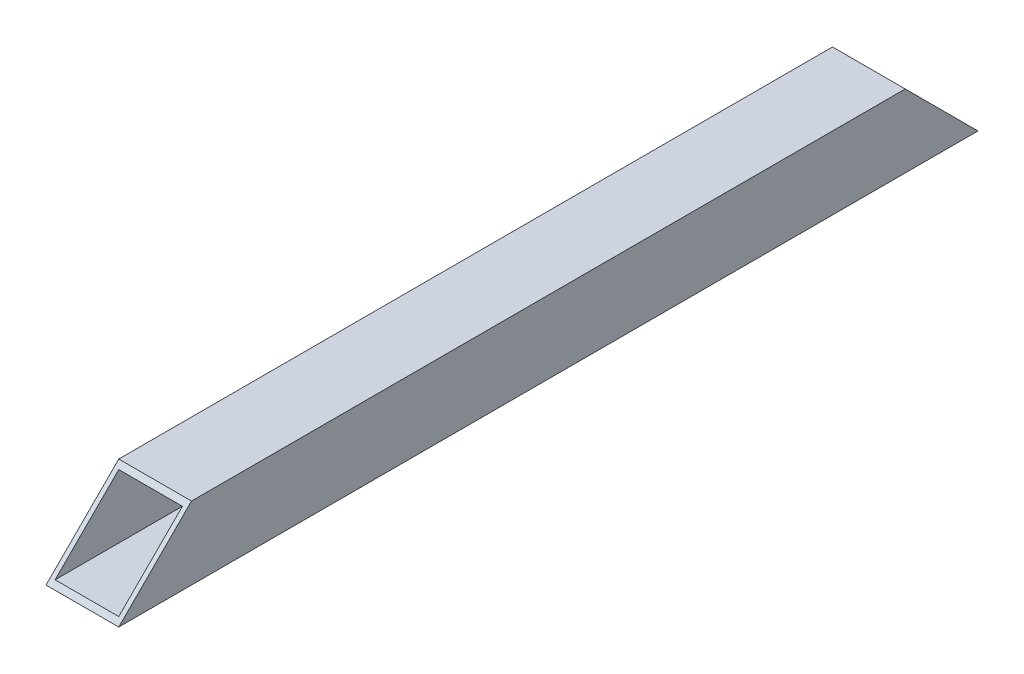
ISO-10303-21;
HEADER;
FILE_DESCRIPTION(('STEP AP214'),'2;1');
FILE_NAME('part.step','',(''),(''),'','','');
FILE_SCHEMA(('AUTOMOTIVE_DESIGN { 1 0 10303 214 1 1 1 1 }'));
ENDSEC;
DATA;
#1=APPLICATION_CONTEXT('core data for automotive mechanical design processes');
#2=APPLICATION_PROTOCOL_DEFINITION('international standard','automotive_design',2000,#1);
#3=PRODUCT_CONTEXT('',#1,'mechanical');
#4=PRODUCT('Part','Part','',(#3));
#5=PRODUCT_RELATED_PRODUCT_CATEGORY('part','',(#4));
#6=PRODUCT_DEFINITION_FORMATION('','',#4);
#7=PRODUCT_DEFINITION_CONTEXT('part definition',#1,'design');
#8=PRODUCT_DEFINITION('design','',#6,#7);
#9=PRODUCT_DEFINITION_SHAPE('','',#8);
#10=(LENGTH_UNIT() NAMED_UNIT(*) SI_UNIT(.MILLI.,.METRE.));
#11=(NAMED_UNIT(*) PLANE_ANGLE_UNIT() SI_UNIT($,.RADIAN.));
#12=(NAMED_UNIT(*) SI_UNIT($,.STERADIAN.) SOLID_ANGLE_UNIT());
#13=UNCERTAINTY_MEASURE_WITH_UNIT(LENGTH_MEASURE(1.E-05),#10,'distance_accuracy_value','');
#14=(GEOMETRIC_REPRESENTATION_CONTEXT(3) GLOBAL_UNCERTAINTY_ASSIGNED_CONTEXT((#13)) GLOBAL_UNIT_ASSIGNED_CONTEXT((#10,
#11,#12)) REPRESENTATION_CONTEXT('',''));
#15=CARTESIAN_POINT('',(0.,0.,0.));
#16=DIRECTION('',(0.,0.,1.));
#17=DIRECTION('',(1.,0.,0.));
#18=AXIS2_PLACEMENT_3D('',#15,#16,#17);
#19=CARTESIAN_POINT('',(11.1125,11.1125,150.));
#20=DIRECTION('',(0.,-1.,0.));
#21=DIRECTION('',(0.,0.,-1.));
#22=AXIS2_PLACEMENT_3D('',#19,#20,#21);
#23=PLANE('',#22);
#24=DIRECTION('',(1.,0.,0.));
#25=VECTOR('',#24,1.);
#26=CARTESIAN_POINT('',(11.1125,11.1125,126.1875));
#27=LINE('',#26,#25);
#28=CARTESIAN_POINT('',(-11.1125,11.1125,126.1875));
#29=VERTEX_POINT('',#28);
#30=CARTESIAN_POINT('',(11.1125,11.1125,126.1875));
#31=VERTEX_POINT('',#30);
#32=EDGE_CURVE('E11',#29,#31,#27,.T.);
#33=ORIENTED_EDGE('',*,*,#32,.F.);
#34=DIRECTION('',(0.,0.,-1.));
#35=VECTOR('',#34,1.);
#36=CARTESIAN_POINT('',(-11.1125,11.1125,150.));
#37=LINE('',#36,#35);
#38=CARTESIAN_POINT('',(-11.1125,11.1125,-126.1875));
#39=VERTEX_POINT('',#38);
#40=EDGE_CURVE('E144',#29,#39,#37,.T.);
#41=ORIENTED_EDGE('',*,*,#40,.T.);
#42=DIRECTION('',(-1.,0.,0.));
#43=VECTOR('',#42,1.);
#44=CARTESIAN_POINT('',(11.1125,11.1125,-126.1875));
#45=LINE('',#44,#43);
#46=CARTESIAN_POINT('',(11.1125,11.1125,-126.1875));
#47=VERTEX_POINT('',#46);
#48=EDGE_CURVE('E44',#47,#39,#45,.T.);
#49=ORIENTED_EDGE('',*,*,#48,.F.);
#50=DIRECTION('',(0.,0.,-1.));
#51=VECTOR('',#50,1.);
#52=CARTESIAN_POINT('',(11.1125,11.1125,150.));
#53=LINE('',#52,#51);
#54=EDGE_CURVE('E151',#31,#47,#53,.T.);
#55=ORIENTED_EDGE('',*,*,#54,.F.);
#56=EDGE_LOOP('',(#33,#41,#49,#55));
#57=FACE_BOUND('',#56,.T.);
#58=ADVANCED_FACE('F36',(#57),#23,.T.);
#59=CARTESIAN_POINT('',(11.1125,-11.1125,150.));
#60=DIRECTION('',(-1.,0.,0.));
#61=DIRECTION('',(0.,-1.,0.));
#62=AXIS2_PLACEMENT_3D('',#59,#60,#61);
#63=PLANE('',#62);
#64=DIRECTION('',(0.,-0.707106781186551,0.707106781186544));
#65=VECTOR('',#64,1.);
#66=CARTESIAN_POINT('',(11.1125,-11.90625,149.20625));
#67=LINE('',#66,#65);
#68=CARTESIAN_POINT('',(11.1125,-11.1125,148.4125));
#69=VERTEX_POINT('',#68);
#70=EDGE_CURVE('E147',#31,#69,#67,.T.);
#71=ORIENTED_EDGE('',*,*,#70,.F.);
#72=ORIENTED_EDGE('',*,*,#54,.T.);
#73=DIRECTION('',(0.,0.707106781186551,0.707106781186544));
#74=VECTOR('',#73,1.);
#75=CARTESIAN_POINT('',(11.1125,138.09375,0.793749999998372));
#76=LINE('',#75,#74);
#77=CARTESIAN_POINT('',(11.1125,-11.1125,-148.4125));
#78=VERTEX_POINT('',#77);
#79=EDGE_CURVE('E106',#78,#47,#76,.T.);
#80=ORIENTED_EDGE('',*,*,#79,.F.);
#81=DIRECTION('',(0.,0.,-1.));
#82=VECTOR('',#81,1.);
#83=CARTESIAN_POINT('',(11.1125,-11.1125,150.));
#84=LINE('',#83,#82);
#85=EDGE_CURVE('E154',#69,#78,#84,.T.);
#86=ORIENTED_EDGE('',*,*,#85,.F.);
#87=EDGE_LOOP('',(#71,#72,#80,#86));
#88=FACE_BOUND('',#87,.T.);
#89=ADVANCED_FACE('F184',(#88),#63,.T.);
#90=CARTESIAN_POINT('',(11.1125,-11.1125,150.));
#91=DIRECTION('',(0.,1.,0.));
#92=DIRECTION('',(0.,0.,1.));
#93=AXIS2_PLACEMENT_3D('',#90,#91,#92);
#94=PLANE('',#93);
#95=DIRECTION('',(-1.,0.,0.));
#96=VECTOR('',#95,1.);
#97=CARTESIAN_POINT('',(11.1125,-11.1125,148.4125));
#98=LINE('',#97,#96);
#99=CARTESIAN_POINT('',(-11.1125,-11.1125,148.4125));
#100=VERTEX_POINT('',#99);
#101=EDGE_CURVE('E156',#69,#100,#98,.T.);
#102=ORIENTED_EDGE('',*,*,#101,.F.);
#103=ORIENTED_EDGE('',*,*,#85,.T.);
#104=DIRECTION('',(1.,0.,0.));
#105=VECTOR('',#104,1.);
#106=CARTESIAN_POINT('',(11.1125,-11.1125,-148.4125));
#107=LINE('',#106,#105);
#108=CARTESIAN_POINT('',(-11.1125,-11.1125,-148.4125));
#109=VERTEX_POINT('',#108);
#110=EDGE_CURVE('E148',#109,#78,#107,.T.);
#111=ORIENTED_EDGE('',*,*,#110,.F.);
#112=DIRECTION('',(0.,0.,-1.));
#113=VECTOR('',#112,1.);
#114=CARTESIAN_POINT('',(-11.1125,-11.1125,150.));
#115=LINE('',#114,#113);
#116=EDGE_CURVE('E146',#100,#109,#115,.T.);
#117=ORIENTED_EDGE('',*,*,#116,.F.);
#118=EDGE_LOOP('',(#102,#103,#111,#117));
#119=FACE_BOUND('',#118,.T.);
#120=ADVANCED_FACE('F182',(#119),#94,.T.);
#121=CARTESIAN_POINT('',(-11.1125,-11.1125,150.));
#122=DIRECTION('',(1.,0.,0.));
#123=DIRECTION('',(0.,0.,-1.));
#124=AXIS2_PLACEMENT_3D('',#121,#122,#123);
#125=PLANE('',#124);
#126=DIRECTION('',(0.,0.707106781186551,-0.707106781186544));
#127=VECTOR('',#126,1.);
#128=CARTESIAN_POINT('',(-11.1125,-11.90625,149.20625));
#129=LINE('',#128,#127);
#130=EDGE_CURVE('E152',#100,#29,#129,.T.);
#131=ORIENTED_EDGE('',*,*,#130,.F.);
#132=ORIENTED_EDGE('',*,*,#116,.T.);
#133=DIRECTION('',(0.,-0.707106781186551,-0.707106781186544));
#134=VECTOR('',#133,1.);
#135=CARTESIAN_POINT('',(-11.1125,138.09375,0.793749999998372));
#136=LINE('',#135,#134);
#137=EDGE_CURVE('E132',#39,#109,#136,.T.);
#138=ORIENTED_EDGE('',*,*,#137,.F.);
#139=ORIENTED_EDGE('',*,*,#40,.F.);
#140=EDGE_LOOP('',(#131,#132,#138,#139));
#141=FACE_BOUND('',#140,.T.);
#142=ADVANCED_FACE('F143',(#141),#125,.T.);
#143=CARTESIAN_POINT('',(-12.7,12.7,-124.6));
#144=DIRECTION('',(0.,-0.707106781186544,0.707106781186551));
#145=DIRECTION('',(0.,-0.707106781186551,-0.707106781186544));
#146=AXIS2_PLACEMENT_3D('',#143,#144,#145);
#147=PLANE('',#146);
#148=ORIENTED_EDGE('',*,*,#137,.T.);
#149=ORIENTED_EDGE('',*,*,#110,.T.);
#150=ORIENTED_EDGE('',*,*,#79,.T.);
#151=ORIENTED_EDGE('',*,*,#48,.T.);
#152=EDGE_LOOP('',(#148,#149,#150,#151));
#153=FACE_BOUND('',#152,.T.);
#154=DIRECTION('',(0.,-0.707106781186551,-0.707106781186544));
#155=VECTOR('',#154,1.);
#156=CARTESIAN_POINT('',(12.7,12.7,-124.6));
#157=LINE('',#156,#155);
#158=CARTESIAN_POINT('',(12.7,12.7,-124.6));
#159=VERTEX_POINT('',#158);
#160=CARTESIAN_POINT('',(12.7,-12.7,-150.));
#161=VERTEX_POINT('',#160);
#162=EDGE_CURVE('E169',#159,#161,#157,.T.);
#163=ORIENTED_EDGE('',*,*,#162,.T.);
#164=DIRECTION('',(1.,0.,0.));
#165=VECTOR('',#164,1.);
#166=CARTESIAN_POINT('',(12.7,-12.7,-150.));
#167=LINE('',#166,#165);
#168=CARTESIAN_POINT('',(-12.7,-12.7,-150.));
#169=VERTEX_POINT('',#168);
#170=EDGE_CURVE('E122',#169,#161,#167,.T.);
#171=ORIENTED_EDGE('',*,*,#170,.F.);
#172=DIRECTION('',(0.,-0.707106781186551,-0.707106781186544));
#173=VECTOR('',#172,1.);
#174=CARTESIAN_POINT('',(-12.7,12.7,-124.6));
#175=LINE('',#174,#173);
#176=CARTESIAN_POINT('',(-12.7,12.7,-124.6));
#177=VERTEX_POINT('',#176);
#178=EDGE_CURVE('E59',#177,#169,#175,.T.);
#179=ORIENTED_EDGE('',*,*,#178,.F.);
#180=DIRECTION('',(1.,0.,0.));
#181=VECTOR('',#180,1.);
#182=CARTESIAN_POINT('',(-12.7,12.7,-124.6));
#183=LINE('',#182,#181);
#184=EDGE_CURVE('E116',#177,#159,#183,.T.);
#185=ORIENTED_EDGE('',*,*,#184,.T.);
#186=EDGE_LOOP('',(#163,#171,#179,#185));
#187=FACE_BOUND('',#186,.T.);
#188=ADVANCED_FACE('F131',(#153,#187),#147,.F.);
#189=CARTESIAN_POINT('',(-12.7,12.7,124.6));
#190=DIRECTION('',(0.,-0.707106781186544,-0.707106781186551));
#191=DIRECTION('',(0.,0.707106781186551,-0.707106781186544));
#192=AXIS2_PLACEMENT_3D('',#189,#190,#191);
#193=PLANE('',#192);
#194=ORIENTED_EDGE('',*,*,#130,.T.);
#195=ORIENTED_EDGE('',*,*,#32,.T.);
#196=ORIENTED_EDGE('',*,*,#70,.T.);
#197=ORIENTED_EDGE('',*,*,#101,.T.);
#198=EDGE_LOOP('',(#194,#195,#196,#197));
#199=FACE_BOUND('',#198,.T.);
#200=DIRECTION('',(0.,0.707106781186551,-0.707106781186544));
#201=VECTOR('',#200,1.);
#202=CARTESIAN_POINT('',(12.7,12.7,124.6));
#203=LINE('',#202,#201);
#204=CARTESIAN_POINT('',(12.7,-12.7,150.));
#205=VERTEX_POINT('',#204);
#206=CARTESIAN_POINT('',(12.7,12.7,124.6));
#207=VERTEX_POINT('',#206);
#208=EDGE_CURVE('E51',#205,#207,#203,.T.);
#209=ORIENTED_EDGE('',*,*,#208,.T.);
#210=DIRECTION('',(1.,0.,0.));
#211=VECTOR('',#210,1.);
#212=CARTESIAN_POINT('',(-12.7,12.7,124.6));
#213=LINE('',#212,#211);
#214=CARTESIAN_POINT('',(-12.7,12.7,124.6));
#215=VERTEX_POINT('',#214);
#216=EDGE_CURVE('E97',#215,#207,#213,.T.);
#217=ORIENTED_EDGE('',*,*,#216,.F.);
#218=DIRECTION('',(0.,0.707106781186551,-0.707106781186544));
#219=VECTOR('',#218,1.);
#220=CARTESIAN_POINT('',(-12.7,12.7,124.6));
#221=LINE('',#220,#219);
#222=CARTESIAN_POINT('',(-12.7,-12.7,150.));
#223=VERTEX_POINT('',#222);
#224=EDGE_CURVE('E100',#223,#215,#221,.T.);
#225=ORIENTED_EDGE('',*,*,#224,.F.);
#226=DIRECTION('',(1.,0.,0.));
#227=VECTOR('',#226,1.);
#228=CARTESIAN_POINT('',(12.7,-12.7,150.));
#229=LINE('',#228,#227);
#230=EDGE_CURVE('E118',#223,#205,#229,.T.);
#231=ORIENTED_EDGE('',*,*,#230,.T.);
#232=EDGE_LOOP('',(#209,#217,#225,#231));
#233=FACE_BOUND('',#232,.T.);
#234=ADVANCED_FACE('F99',(#199,#233),#193,.F.);
#235=CARTESIAN_POINT('',(-12.7,-12.7,150.));
#236=DIRECTION('',(1.,0.,0.));
#237=DIRECTION('',(0.,0.,-1.));
#238=AXIS2_PLACEMENT_3D('',#235,#236,#237);
#239=PLANE('',#238);
#240=DIRECTION('',(0.,0.,-1.));
#241=VECTOR('',#240,1.);
#242=CARTESIAN_POINT('',(-12.7,-12.7,150.));
#243=LINE('',#242,#241);
#244=EDGE_CURVE('E113',#223,#169,#243,.T.);
#245=ORIENTED_EDGE('',*,*,#244,.F.);
#246=ORIENTED_EDGE('',*,*,#224,.T.);
#247=DIRECTION('',(0.,0.,-1.));
#248=VECTOR('',#247,1.);
#249=CARTESIAN_POINT('',(-12.7,12.7,150.));
#250=LINE('',#249,#248);
#251=EDGE_CURVE('E111',#215,#177,#250,.T.);
#252=ORIENTED_EDGE('',*,*,#251,.T.);
#253=ORIENTED_EDGE('',*,*,#178,.T.);
#254=EDGE_LOOP('',(#245,#246,#252,#253));
#255=FACE_BOUND('',#254,.T.);
#256=ADVANCED_FACE('F38',(#255),#239,.F.);
#257=CARTESIAN_POINT('',(12.7,-12.7,150.));
#258=DIRECTION('',(0.,1.,0.));
#259=DIRECTION('',(0.,0.,1.));
#260=AXIS2_PLACEMENT_3D('',#257,#258,#259);
#261=PLANE('',#260);
#262=ORIENTED_EDGE('',*,*,#170,.T.);
#263=DIRECTION('',(0.,0.,-1.));
#264=VECTOR('',#263,1.);
#265=CARTESIAN_POINT('',(12.7,-12.7,150.));
#266=LINE('',#265,#264);
#267=EDGE_CURVE('E120',#205,#161,#266,.T.);
#268=ORIENTED_EDGE('',*,*,#267,.F.);
#269=ORIENTED_EDGE('',*,*,#230,.F.);
#270=ORIENTED_EDGE('',*,*,#244,.T.);
#271=EDGE_LOOP('',(#262,#268,#269,#270));
#272=FACE_BOUND('',#271,.T.);
#273=ADVANCED_FACE('F165',(#272),#261,.F.);
#274=CARTESIAN_POINT('',(12.7,-12.7,150.));
#275=DIRECTION('',(-1.,0.,0.));
#276=DIRECTION('',(0.,-1.,0.));
#277=AXIS2_PLACEMENT_3D('',#274,#275,#276);
#278=PLANE('',#277);
#279=DIRECTION('',(0.,0.,-1.));
#280=VECTOR('',#279,1.);
#281=CARTESIAN_POINT('',(12.7,12.7,150.));
#282=LINE('',#281,#280);
#283=EDGE_CURVE('E117',#207,#159,#282,.T.);
#284=ORIENTED_EDGE('',*,*,#283,.F.);
#285=ORIENTED_EDGE('',*,*,#208,.F.);
#286=ORIENTED_EDGE('',*,*,#267,.T.);
#287=ORIENTED_EDGE('',*,*,#162,.F.);
#288=EDGE_LOOP('',(#284,#285,#286,#287));
#289=FACE_BOUND('',#288,.T.);
#290=ADVANCED_FACE('F168',(#289),#278,.F.);
#291=CARTESIAN_POINT('',(12.7,12.7,150.));
#292=DIRECTION('',(0.,-1.,0.));
#293=DIRECTION('',(0.,0.,-1.));
#294=AXIS2_PLACEMENT_3D('',#291,#292,#293);
#295=PLANE('',#294);
#296=ORIENTED_EDGE('',*,*,#251,.F.);
#297=ORIENTED_EDGE('',*,*,#216,.T.);
#298=ORIENTED_EDGE('',*,*,#283,.T.);
#299=ORIENTED_EDGE('',*,*,#184,.F.);
#300=EDGE_LOOP('',(#296,#297,#298,#299));
#301=FACE_BOUND('',#300,.T.);
#302=ADVANCED_FACE('F115',(#301),#295,.F.);
#303=CLOSED_SHELL('',(#58,#89,#120,#142,#188,#234,#256,#273,#290,#302));
#304=MANIFOLD_SOLID_BREP('B2',#303);
#305=ADVANCED_BREP_SHAPE_REPRESENTATION('',(#18,#304),#14);
#306=SHAPE_DEFINITION_REPRESENTATION(#9,#305);
ENDSEC;
END-ISO-10303-21;
